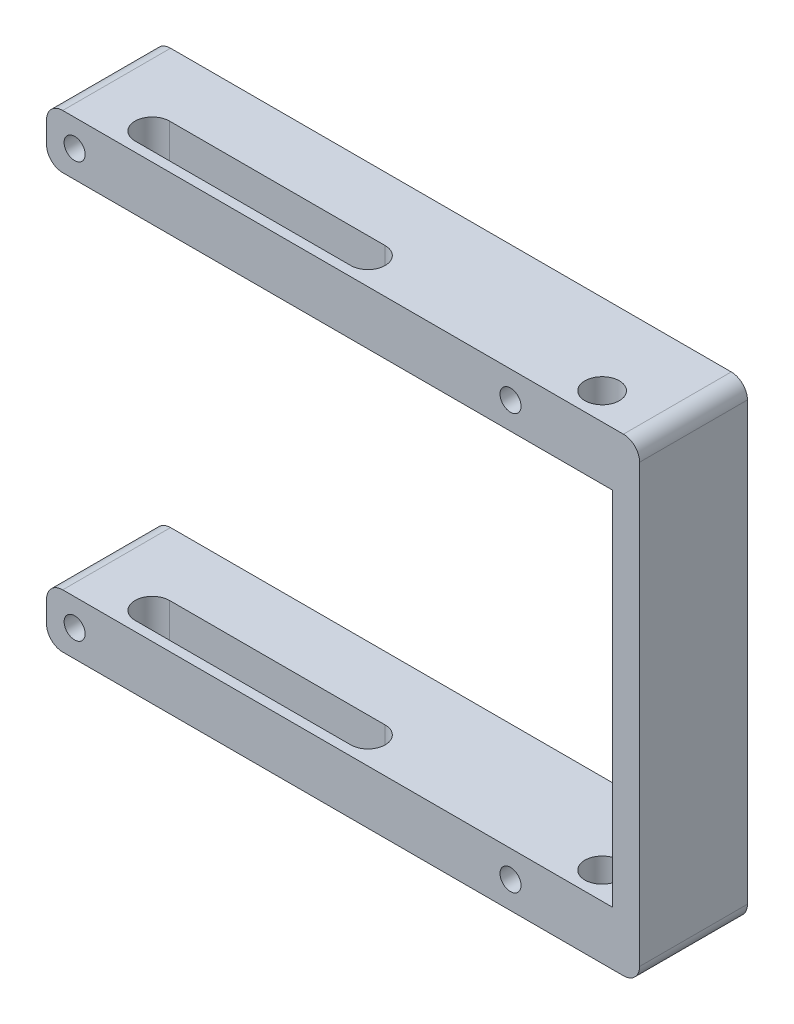
ISO-10303-21;
HEADER;
FILE_DESCRIPTION(('STEP AP214'),'2;1');
FILE_NAME('part.step','',(''),(''),'','','');
FILE_SCHEMA(('AUTOMOTIVE_DESIGN { 1 0 10303 214 1 1 1 1 }'));
ENDSEC;
DATA;
#1=APPLICATION_CONTEXT('core data for automotive mechanical design processes');
#2=APPLICATION_PROTOCOL_DEFINITION('international standard','automotive_design',2000,#1);
#3=PRODUCT_CONTEXT('',#1,'mechanical');
#4=PRODUCT('Part','Part','',(#3));
#5=PRODUCT_RELATED_PRODUCT_CATEGORY('part','',(#4));
#6=PRODUCT_DEFINITION_FORMATION('','',#4);
#7=PRODUCT_DEFINITION_CONTEXT('part definition',#1,'design');
#8=PRODUCT_DEFINITION('design','',#6,#7);
#9=PRODUCT_DEFINITION_SHAPE('','',#8);
#10=(LENGTH_UNIT() NAMED_UNIT(*) SI_UNIT(.MILLI.,.METRE.));
#11=(NAMED_UNIT(*) PLANE_ANGLE_UNIT() SI_UNIT($,.RADIAN.));
#12=(NAMED_UNIT(*) SI_UNIT($,.STERADIAN.) SOLID_ANGLE_UNIT());
#13=UNCERTAINTY_MEASURE_WITH_UNIT(LENGTH_MEASURE(1.E-05),#10,'distance_accuracy_value','');
#14=(GEOMETRIC_REPRESENTATION_CONTEXT(3) GLOBAL_UNCERTAINTY_ASSIGNED_CONTEXT((#13)) GLOBAL_UNIT_ASSIGNED_CONTEXT((#10,
#11,#12)) REPRESENTATION_CONTEXT('',''));
#15=CARTESIAN_POINT('',(0.,0.,0.));
#16=DIRECTION('',(0.,0.,1.));
#17=DIRECTION('',(1.,0.,0.));
#18=AXIS2_PLACEMENT_3D('',#15,#16,#17);
#19=CARTESIAN_POINT('',(0.,82.,10.));
#20=DIRECTION('',(0.,-1.,0.));
#21=DIRECTION('',(1.,0.,0.));
#22=AXIS2_PLACEMENT_3D('',#19,#20,#21);
#23=PLANE('',#22);
#24=CARTESIAN_POINT('',(55.8604947928131,82.,5.));
#25=DIRECTION('',(0.,-1.,0.));
#26=DIRECTION('',(1.,0.,0.));
#27=AXIS2_PLACEMENT_3D('',#24,#25,#26);
#28=CIRCLE('',#27,3.2);
#29=CARTESIAN_POINT('',(59.0604947928131,82.,5.));
#30=VERTEX_POINT('',#29);
#31=EDGE_CURVE('E353',#30,#30,#28,.T.);
#32=ORIENTED_EDGE('',*,*,#31,.F.);
#33=EDGE_LOOP('',(#32));
#34=FACE_BOUND('',#33,.T.);
#35=CARTESIAN_POINT('',(12.4256524417899,82.,5.00000000000001));
#36=DIRECTION('',(0.,-1.,0.));
#37=DIRECTION('',(1.,0.,0.));
#38=AXIS2_PLACEMENT_3D('',#35,#36,#37);
#39=CIRCLE('',#38,3.2);
#40=CARTESIAN_POINT('',(12.4256524417899,82.,1.80000000000001));
#41=VERTEX_POINT('',#40);
#42=CARTESIAN_POINT('',(12.4256524417899,82.,8.20000000000001));
#43=VERTEX_POINT('',#42);
#44=EDGE_CURVE('E348',#41,#43,#39,.T.);
#45=ORIENTED_EDGE('',*,*,#44,.F.);
#46=DIRECTION('',(1.,0.,0.));
#47=VECTOR('',#46,1.);
#48=CARTESIAN_POINT('',(0.,82.,1.80000000000001));
#49=LINE('',#48,#47);
#50=CARTESIAN_POINT('',(-27.5743475582102,82.0000000000001,1.80000000000001));
#51=VERTEX_POINT('',#50);
#52=EDGE_CURVE('E332',#51,#41,#49,.T.);
#53=ORIENTED_EDGE('',*,*,#52,.F.);
#54=CARTESIAN_POINT('',(-27.5743475582101,82.0000000000001,5.));
#55=DIRECTION('',(0.,-1.,0.));
#56=DIRECTION('',(1.,0.,0.));
#57=AXIS2_PLACEMENT_3D('',#54,#55,#56);
#58=CIRCLE('',#57,3.2);
#59=CARTESIAN_POINT('',(-27.5743475582101,82.0000000000001,8.20000000000002));
#60=VERTEX_POINT('',#59);
#61=EDGE_CURVE('E337',#60,#51,#58,.T.);
#62=ORIENTED_EDGE('',*,*,#61,.F.);
#63=DIRECTION('',(-1.,0.,0.));
#64=VECTOR('',#63,1.);
#65=CARTESIAN_POINT('',(0.,82.,8.20000000000001));
#66=LINE('',#65,#64);
#67=EDGE_CURVE('E343',#43,#60,#66,.T.);
#68=ORIENTED_EDGE('',*,*,#67,.F.);
#69=EDGE_LOOP('',(#45,#53,#62,#68));
#70=FACE_BOUND('',#69,.T.);
#71=DIRECTION('',(-1.,0.,0.));
#72=VECTOR('',#71,1.);
#73=CARTESIAN_POINT('',(0.,82.,10.));
#74=LINE('',#73,#72);
#75=CARTESIAN_POINT('',(62.8142757664546,82.,10.));
#76=VERTEX_POINT('',#75);
#77=CARTESIAN_POINT('',(-39.1857242335454,82.0000000000001,10.));
#78=VERTEX_POINT('',#77);
#79=EDGE_CURVE('E356',#76,#78,#74,.T.);
#80=ORIENTED_EDGE('',*,*,#79,.T.);
#81=DIRECTION('',(0.,0.,-1.));
#82=VECTOR('',#81,1.);
#83=CARTESIAN_POINT('',(-39.1857242335454,82.0000000000001,0.));
#84=LINE('',#83,#82);
#85=CARTESIAN_POINT('',(-39.1857242335454,82.0000000000001,-10.));
#86=VERTEX_POINT('',#85);
#87=EDGE_CURVE('E11',#78,#86,#84,.T.);
#88=ORIENTED_EDGE('',*,*,#87,.T.);
#89=DIRECTION('',(-1.,0.,0.));
#90=VECTOR('',#89,1.);
#91=CARTESIAN_POINT('',(62.8142757664546,82.,-10.));
#92=LINE('',#91,#90);
#93=CARTESIAN_POINT('',(62.8142757664546,82.,-10.));
#94=VERTEX_POINT('',#93);
#95=EDGE_CURVE('E243',#94,#86,#92,.T.);
#96=ORIENTED_EDGE('',*,*,#95,.F.);
#97=DIRECTION('',(0.,0.,-1.));
#98=VECTOR('',#97,1.);
#99=CARTESIAN_POINT('',(62.8142757664546,82.,10.));
#100=LINE('',#99,#98);
#101=EDGE_CURVE('E195',#76,#94,#100,.T.);
#102=ORIENTED_EDGE('',*,*,#101,.F.);
#103=EDGE_LOOP('',(#80,#88,#96,#102));
#104=FACE_BOUND('',#103,.T.);
#105=ADVANCED_FACE('F38',(#34,#70,#104),#23,.T.);
#106=CARTESIAN_POINT('',(62.8142757664546,0.,10.));
#107=DIRECTION('',(1.,0.,0.));
#108=DIRECTION('',(0.,1.,0.));
#109=AXIS2_PLACEMENT_3D('',#106,#107,#108);
#110=PLANE('',#109);
#111=ORIENTED_EDGE('',*,*,#101,.T.);
#112=DIRECTION('',(0.,1.,0.));
#113=VECTOR('',#112,1.);
#114=CARTESIAN_POINT('',(62.8142757664546,15.,-10.));
#115=LINE('',#114,#113);
#116=CARTESIAN_POINT('',(62.8142757664546,15.,-10.));
#117=VERTEX_POINT('',#116);
#118=EDGE_CURVE('E240',#117,#94,#115,.T.);
#119=ORIENTED_EDGE('',*,*,#118,.F.);
#120=DIRECTION('',(0.,0.,-1.));
#121=VECTOR('',#120,1.);
#122=CARTESIAN_POINT('',(62.8142757664546,15.,10.));
#123=LINE('',#122,#121);
#124=CARTESIAN_POINT('',(62.8142757664546,15.,10.));
#125=VERTEX_POINT('',#124);
#126=EDGE_CURVE('E377',#125,#117,#123,.T.);
#127=ORIENTED_EDGE('',*,*,#126,.F.);
#128=DIRECTION('',(0.,-1.,0.));
#129=VECTOR('',#128,1.);
#130=CARTESIAN_POINT('',(62.8142757664546,0.,10.));
#131=LINE('',#130,#129);
#132=EDGE_CURVE('E359',#76,#125,#131,.T.);
#133=ORIENTED_EDGE('',*,*,#132,.F.);
#134=EDGE_LOOP('',(#111,#119,#127,#133));
#135=FACE_BOUND('',#134,.T.);
#136=ADVANCED_FACE('F420',(#135),#110,.F.);
#137=CARTESIAN_POINT('',(0.,15.,10.));
#138=DIRECTION('',(0.,-1.,0.));
#139=DIRECTION('',(1.,0.,0.));
#140=AXIS2_PLACEMENT_3D('',#137,#138,#139);
#141=PLANE('',#140);
#142=CARTESIAN_POINT('',(55.860494792813,15.,5.));
#143=DIRECTION('',(0.,-1.,0.));
#144=DIRECTION('',(1.,0.,0.));
#145=AXIS2_PLACEMENT_3D('',#142,#143,#144);
#146=CIRCLE('',#145,3.2);
#147=CARTESIAN_POINT('',(59.060494792813,15.,5.));
#148=VERTEX_POINT('',#147);
#149=EDGE_CURVE('E350',#148,#148,#146,.T.);
#150=ORIENTED_EDGE('',*,*,#149,.T.);
#151=EDGE_LOOP('',(#150));
#152=FACE_BOUND('',#151,.T.);
#153=DIRECTION('',(1.,0.,0.));
#154=VECTOR('',#153,1.);
#155=CARTESIAN_POINT('',(0.,15.,1.80000000000001));
#156=LINE('',#155,#154);
#157=CARTESIAN_POINT('',(-27.5743475582102,15.,1.8));
#158=VERTEX_POINT('',#157);
#159=CARTESIAN_POINT('',(12.4256524417899,15.,1.80000000000001));
#160=VERTEX_POINT('',#159);
#161=EDGE_CURVE('E289',#158,#160,#156,.T.);
#162=ORIENTED_EDGE('',*,*,#161,.T.);
#163=CARTESIAN_POINT('',(12.4256524417898,15.,5.00000000000001));
#164=DIRECTION('',(0.,-1.,0.));
#165=DIRECTION('',(1.,0.,0.));
#166=AXIS2_PLACEMENT_3D('',#163,#164,#165);
#167=CIRCLE('',#166,3.2);
#168=CARTESIAN_POINT('',(12.4256524417898,15.,8.20000000000001));
#169=VERTEX_POINT('',#168);
#170=EDGE_CURVE('E345',#160,#169,#167,.T.);
#171=ORIENTED_EDGE('',*,*,#170,.T.);
#172=DIRECTION('',(-1.,0.,0.));
#173=VECTOR('',#172,1.);
#174=CARTESIAN_POINT('',(0.,15.,8.20000000000001));
#175=LINE('',#174,#173);
#176=CARTESIAN_POINT('',(-27.5743475582102,15.,8.20000000000002));
#177=VERTEX_POINT('',#176);
#178=EDGE_CURVE('E340',#169,#177,#175,.T.);
#179=ORIENTED_EDGE('',*,*,#178,.T.);
#180=CARTESIAN_POINT('',(-27.5743475582102,15.,5.));
#181=DIRECTION('',(0.,-1.,0.));
#182=DIRECTION('',(1.,0.,0.));
#183=AXIS2_PLACEMENT_3D('',#180,#181,#182);
#184=CIRCLE('',#183,3.2);
#185=EDGE_CURVE('E334',#177,#158,#184,.T.);
#186=ORIENTED_EDGE('',*,*,#185,.T.);
#187=EDGE_LOOP('',(#162,#171,#179,#186));
#188=FACE_BOUND('',#187,.T.);
#189=ORIENTED_EDGE('',*,*,#126,.T.);
#190=DIRECTION('',(1.,0.,0.));
#191=VECTOR('',#190,1.);
#192=CARTESIAN_POINT('',(-39.1857242335454,15.,-10.));
#193=LINE('',#192,#191);
#194=CARTESIAN_POINT('',(-39.1857242335454,15.,-10.));
#195=VERTEX_POINT('',#194);
#196=EDGE_CURVE('E237',#195,#117,#193,.T.);
#197=ORIENTED_EDGE('',*,*,#196,.F.);
#198=DIRECTION('',(0.,0.,-1.));
#199=VECTOR('',#198,1.);
#200=CARTESIAN_POINT('',(-39.1857242335454,15.,10.));
#201=LINE('',#200,#199);
#202=CARTESIAN_POINT('',(-39.1857242335454,15.,10.));
#203=VERTEX_POINT('',#202);
#204=EDGE_CURVE('E404',#195,#203,#201,.F.);
#205=ORIENTED_EDGE('',*,*,#204,.T.);
#206=DIRECTION('',(-1.,0.,0.));
#207=VECTOR('',#206,1.);
#208=CARTESIAN_POINT('',(0.,15.,10.));
#209=LINE('',#208,#207);
#210=EDGE_CURVE('E361',#125,#203,#209,.T.);
#211=ORIENTED_EDGE('',*,*,#210,.F.);
#212=EDGE_LOOP('',(#189,#197,#205,#211));
#213=FACE_BOUND('',#212,.T.);
#214=ADVANCED_FACE('F470',(#152,#188,#213),#141,.F.);
#215=CARTESIAN_POINT('',(-42.1857242335454,0.,10.));
#216=DIRECTION('',(-1.,0.,0.));
#217=DIRECTION('',(0.,0.,1.));
#218=AXIS2_PLACEMENT_3D('',#215,#216,#217);
#219=PLANE('',#218);
#220=DIRECTION('',(0.,0.,-1.));
#221=VECTOR('',#220,1.);
#222=CARTESIAN_POINT('',(-42.1857242335454,12.,0.));
#223=LINE('',#222,#221);
#224=CARTESIAN_POINT('',(-42.1857242335454,12.,10.));
#225=VERTEX_POINT('',#224);
#226=CARTESIAN_POINT('',(-42.1857242335454,12.,-10.));
#227=VERTEX_POINT('',#226);
#228=EDGE_CURVE('E400',#225,#227,#223,.T.);
#229=ORIENTED_EDGE('',*,*,#228,.T.);
#230=DIRECTION('',(0.,1.,0.));
#231=VECTOR('',#230,1.);
#232=CARTESIAN_POINT('',(-42.1857242335454,7.99999999999997,-10.));
#233=LINE('',#232,#231);
#234=CARTESIAN_POINT('',(-42.1857242335454,7.99999999999997,-10.));
#235=VERTEX_POINT('',#234);
#236=EDGE_CURVE('E231',#235,#227,#233,.T.);
#237=ORIENTED_EDGE('',*,*,#236,.F.);
#238=DIRECTION('',(0.,0.,-1.));
#239=VECTOR('',#238,1.);
#240=CARTESIAN_POINT('',(-42.1857242335454,7.99999999999997,10.));
#241=LINE('',#240,#239);
#242=CARTESIAN_POINT('',(-42.1857242335454,7.99999999999997,10.));
#243=VERTEX_POINT('',#242);
#244=EDGE_CURVE('E402',#235,#243,#241,.F.);
#245=ORIENTED_EDGE('',*,*,#244,.T.);
#246=DIRECTION('',(0.,1.,0.));
#247=VECTOR('',#246,1.);
#248=CARTESIAN_POINT('',(-42.1857242335454,0.,10.));
#249=LINE('',#248,#247);
#250=EDGE_CURVE('E364',#243,#225,#249,.T.);
#251=ORIENTED_EDGE('',*,*,#250,.T.);
#252=EDGE_LOOP('',(#229,#237,#245,#251));
#253=FACE_BOUND('',#252,.T.);
#254=ADVANCED_FACE('F432',(#253),#219,.T.);
#255=CARTESIAN_POINT('',(0.,4.99999999999998,10.));
#256=DIRECTION('',(0.,-1.,0.));
#257=DIRECTION('',(1.,0.,0.));
#258=AXIS2_PLACEMENT_3D('',#255,#256,#257);
#259=PLANE('',#258);
#260=CARTESIAN_POINT('',(55.860494792813,4.99999999999991,5.));
#261=DIRECTION('',(0.,1.,0.));
#262=DIRECTION('',(-1.,0.,0.));
#263=AXIS2_PLACEMENT_3D('',#260,#261,#262);
#264=CIRCLE('',#263,3.2);
#265=CARTESIAN_POINT('',(52.660494792813,4.99999999999991,5.));
#266=VERTEX_POINT('',#265);
#267=EDGE_CURVE('E286',#266,#266,#264,.T.);
#268=ORIENTED_EDGE('',*,*,#267,.T.);
#269=EDGE_LOOP('',(#268));
#270=FACE_BOUND('',#269,.T.);
#271=CARTESIAN_POINT('',(12.4256524417898,4.99999999999994,5.00000000000001));
#272=DIRECTION('',(0.,1.,0.));
#273=DIRECTION('',(-1.,0.,0.));
#274=AXIS2_PLACEMENT_3D('',#271,#272,#273);
#275=CIRCLE('',#274,3.2);
#276=CARTESIAN_POINT('',(12.4256524417898,4.99999999999994,8.20000000000001));
#277=VERTEX_POINT('',#276);
#278=CARTESIAN_POINT('',(12.4256524417898,4.99999999999994,1.80000000000001));
#279=VERTEX_POINT('',#278);
#280=EDGE_CURVE('E294',#277,#279,#275,.T.);
#281=ORIENTED_EDGE('',*,*,#280,.T.);
#282=DIRECTION('',(-1.,0.,0.));
#283=VECTOR('',#282,1.);
#284=CARTESIAN_POINT('',(12.4256524417898,4.99999999999994,1.80000000000001));
#285=LINE('',#284,#283);
#286=CARTESIAN_POINT('',(-27.5743475582102,4.99999999999998,1.80000000000001));
#287=VERTEX_POINT('',#286);
#288=EDGE_CURVE('E297',#279,#287,#285,.T.);
#289=ORIENTED_EDGE('',*,*,#288,.T.);
#290=CARTESIAN_POINT('',(-27.5743475582102,4.99999999999998,5.));
#291=DIRECTION('',(0.,1.,0.));
#292=DIRECTION('',(-1.,0.,0.));
#293=AXIS2_PLACEMENT_3D('',#290,#291,#292);
#294=CIRCLE('',#293,3.2);
#295=CARTESIAN_POINT('',(-27.5743475582102,4.99999999999998,8.20000000000002));
#296=VERTEX_POINT('',#295);
#297=EDGE_CURVE('E301',#287,#296,#294,.T.);
#298=ORIENTED_EDGE('',*,*,#297,.T.);
#299=DIRECTION('',(1.,0.,0.));
#300=VECTOR('',#299,1.);
#301=CARTESIAN_POINT('',(12.4256524417898,4.99999999999994,8.20000000000001));
#302=LINE('',#301,#300);
#303=EDGE_CURVE('E304',#296,#277,#302,.T.);
#304=ORIENTED_EDGE('',*,*,#303,.T.);
#305=EDGE_LOOP('',(#281,#289,#298,#304));
#306=FACE_BOUND('',#305,.T.);
#307=DIRECTION('',(0.,0.,-1.));
#308=VECTOR('',#307,1.);
#309=CARTESIAN_POINT('',(-39.1857242335454,4.99999999999997,10.));
#310=LINE('',#309,#308);
#311=CARTESIAN_POINT('',(-39.1857242335454,4.99999999999997,10.));
#312=VERTEX_POINT('',#311);
#313=CARTESIAN_POINT('',(-39.1857242335454,4.99999999999997,-10.));
#314=VERTEX_POINT('',#313);
#315=EDGE_CURVE('E396',#312,#314,#310,.T.);
#316=ORIENTED_EDGE('',*,*,#315,.T.);
#317=DIRECTION('',(-1.,0.,0.));
#318=VECTOR('',#317,1.);
#319=CARTESIAN_POINT('',(64.8142757664545,4.99999999999999,-10.));
#320=LINE('',#319,#318);
#321=CARTESIAN_POINT('',(64.8142757664545,4.99999999999999,-10.));
#322=VERTEX_POINT('',#321);
#323=EDGE_CURVE('E225',#322,#314,#320,.T.);
#324=ORIENTED_EDGE('',*,*,#323,.F.);
#325=DIRECTION('',(0.,0.,-1.));
#326=VECTOR('',#325,1.);
#327=CARTESIAN_POINT('',(64.8142757664545,4.99999999999999,10.));
#328=LINE('',#327,#326);
#329=CARTESIAN_POINT('',(64.8142757664545,4.99999999999999,10.));
#330=VERTEX_POINT('',#329);
#331=EDGE_CURVE('E398',#322,#330,#328,.F.);
#332=ORIENTED_EDGE('',*,*,#331,.T.);
#333=DIRECTION('',(-1.,0.,0.));
#334=VECTOR('',#333,1.);
#335=CARTESIAN_POINT('',(0.,4.99999999999998,10.));
#336=LINE('',#335,#334);
#337=EDGE_CURVE('E367',#330,#312,#336,.T.);
#338=ORIENTED_EDGE('',*,*,#337,.T.);
#339=EDGE_LOOP('',(#316,#324,#332,#338));
#340=FACE_BOUND('',#339,.T.);
#341=ADVANCED_FACE('F442',(#270,#306,#340),#259,.T.);
#342=CARTESIAN_POINT('',(67.8142757664545,0.,10.));
#343=DIRECTION('',(1.,0.,0.));
#344=DIRECTION('',(0.,1.,0.));
#345=AXIS2_PLACEMENT_3D('',#342,#343,#344);
#346=PLANE('',#345);
#347=DIRECTION('',(0.,0.,-1.));
#348=VECTOR('',#347,1.);
#349=CARTESIAN_POINT('',(67.8142757664545,7.99999999999998,10.));
#350=LINE('',#349,#348);
#351=CARTESIAN_POINT('',(67.8142757664545,7.99999999999998,10.));
#352=VERTEX_POINT('',#351);
#353=CARTESIAN_POINT('',(67.8142757664545,7.99999999999998,-10.));
#354=VERTEX_POINT('',#353);
#355=EDGE_CURVE('E381',#352,#354,#350,.T.);
#356=ORIENTED_EDGE('',*,*,#355,.T.);
#357=DIRECTION('',(0.,-1.,0.));
#358=VECTOR('',#357,1.);
#359=CARTESIAN_POINT('',(67.8142757664546,89.,-10.));
#360=LINE('',#359,#358);
#361=CARTESIAN_POINT('',(67.8142757664546,89.,-10.));
#362=VERTEX_POINT('',#361);
#363=EDGE_CURVE('E219',#362,#354,#360,.T.);
#364=ORIENTED_EDGE('',*,*,#363,.F.);
#365=DIRECTION('',(0.,0.,-1.));
#366=VECTOR('',#365,1.);
#367=CARTESIAN_POINT('',(67.8142757664546,89.,10.));
#368=LINE('',#367,#366);
#369=CARTESIAN_POINT('',(67.8142757664546,89.,10.));
#370=VERTEX_POINT('',#369);
#371=EDGE_CURVE('E383',#362,#370,#368,.F.);
#372=ORIENTED_EDGE('',*,*,#371,.T.);
#373=DIRECTION('',(0.,-1.,0.));
#374=VECTOR('',#373,1.);
#375=CARTESIAN_POINT('',(67.8142757664545,0.,10.));
#376=LINE('',#375,#374);
#377=EDGE_CURVE('E370',#370,#352,#376,.T.);
#378=ORIENTED_EDGE('',*,*,#377,.T.);
#379=EDGE_LOOP('',(#356,#364,#372,#378));
#380=FACE_BOUND('',#379,.T.);
#381=ADVANCED_FACE('F449',(#380),#346,.T.);
#382=CARTESIAN_POINT('',(0.,92.,10.));
#383=DIRECTION('',(0.,-1.,0.));
#384=DIRECTION('',(1.,0.,0.));
#385=AXIS2_PLACEMENT_3D('',#382,#383,#384);
#386=PLANE('',#385);
#387=CARTESIAN_POINT('',(55.8604947928131,92.,5.));
#388=DIRECTION('',(0.,1.,0.));
#389=DIRECTION('',(-1.,0.,0.));
#390=AXIS2_PLACEMENT_3D('',#387,#388,#389);
#391=CIRCLE('',#390,3.2);
#392=CARTESIAN_POINT('',(52.6604947928131,92.,5.));
#393=VERTEX_POINT('',#392);
#394=EDGE_CURVE('E290',#393,#393,#391,.T.);
#395=ORIENTED_EDGE('',*,*,#394,.F.);
#396=EDGE_LOOP('',(#395));
#397=FACE_BOUND('',#396,.T.);
#398=DIRECTION('',(-1.,0.,0.));
#399=VECTOR('',#398,1.);
#400=CARTESIAN_POINT('',(12.4256524417899,92.,1.80000000000001));
#401=LINE('',#400,#399);
#402=CARTESIAN_POINT('',(12.4256524417899,92.,1.80000000000001));
#403=VERTEX_POINT('',#402);
#404=CARTESIAN_POINT('',(-27.5743475582101,92.0000000000001,1.8));
#405=VERTEX_POINT('',#404);
#406=EDGE_CURVE('E309',#403,#405,#401,.T.);
#407=ORIENTED_EDGE('',*,*,#406,.F.);
#408=CARTESIAN_POINT('',(12.4256524417899,92.,5.00000000000001));
#409=DIRECTION('',(0.,1.,0.));
#410=DIRECTION('',(-1.,0.,0.));
#411=AXIS2_PLACEMENT_3D('',#408,#409,#410);
#412=CIRCLE('',#411,3.2);
#413=CARTESIAN_POINT('',(12.4256524417899,92.,8.20000000000001));
#414=VERTEX_POINT('',#413);
#415=EDGE_CURVE('E283',#414,#403,#412,.T.);
#416=ORIENTED_EDGE('',*,*,#415,.F.);
#417=DIRECTION('',(1.,0.,0.));
#418=VECTOR('',#417,1.);
#419=CARTESIAN_POINT('',(12.4256524417899,92.,8.20000000000001));
#420=LINE('',#419,#418);
#421=CARTESIAN_POINT('',(-27.5743475582101,92.0000000000001,8.20000000000002));
#422=VERTEX_POINT('',#421);
#423=EDGE_CURVE('E298',#422,#414,#420,.T.);
#424=ORIENTED_EDGE('',*,*,#423,.F.);
#425=CARTESIAN_POINT('',(-27.5743475582101,92.0000000000001,5.));
#426=DIRECTION('',(0.,1.,0.));
#427=DIRECTION('',(-1.,0.,0.));
#428=AXIS2_PLACEMENT_3D('',#425,#426,#427);
#429=CIRCLE('',#428,3.2);
#430=EDGE_CURVE('E312',#405,#422,#429,.T.);
#431=ORIENTED_EDGE('',*,*,#430,.F.);
#432=EDGE_LOOP('',(#407,#416,#424,#431));
#433=FACE_BOUND('',#432,.T.);
#434=DIRECTION('',(-1.,0.,0.));
#435=VECTOR('',#434,1.);
#436=CARTESIAN_POINT('',(0.,92.,10.));
#437=LINE('',#436,#435);
#438=CARTESIAN_POINT('',(64.8142757664546,92.,10.));
#439=VERTEX_POINT('',#438);
#440=CARTESIAN_POINT('',(-39.1857242335454,92.0000000000001,10.));
#441=VERTEX_POINT('',#440);
#442=EDGE_CURVE('E373',#439,#441,#437,.T.);
#443=ORIENTED_EDGE('',*,*,#442,.F.);
#444=DIRECTION('',(0.,0.,-1.));
#445=VECTOR('',#444,1.);
#446=CARTESIAN_POINT('',(64.8142757664546,92.,0.));
#447=LINE('',#446,#445);
#448=CARTESIAN_POINT('',(64.8142757664546,92.,-10.));
#449=VERTEX_POINT('',#448);
#450=EDGE_CURVE('E194',#439,#449,#447,.T.);
#451=ORIENTED_EDGE('',*,*,#450,.T.);
#452=DIRECTION('',(1.,0.,0.));
#453=VECTOR('',#452,1.);
#454=CARTESIAN_POINT('',(-39.1857242335454,92.0000000000001,-10.));
#455=LINE('',#454,#453);
#456=CARTESIAN_POINT('',(-39.1857242335454,92.0000000000001,-10.));
#457=VERTEX_POINT('',#456);
#458=EDGE_CURVE('E198',#457,#449,#455,.T.);
#459=ORIENTED_EDGE('',*,*,#458,.F.);
#460=DIRECTION('',(0.,0.,-1.));
#461=VECTOR('',#460,1.);
#462=CARTESIAN_POINT('',(-39.1857242335454,92.0000000000001,10.));
#463=LINE('',#462,#461);
#464=EDGE_CURVE('E186',#457,#441,#463,.F.);
#465=ORIENTED_EDGE('',*,*,#464,.T.);
#466=EDGE_LOOP('',(#443,#451,#459,#465));
#467=FACE_BOUND('',#466,.T.);
#468=ADVANCED_FACE('F199',(#397,#433,#467),#386,.F.);
#469=CARTESIAN_POINT('',(-42.1857242335454,0.,10.));
#470=DIRECTION('',(1.,0.,0.));
#471=DIRECTION('',(0.,0.,-1.));
#472=AXIS2_PLACEMENT_3D('',#469,#470,#471);
#473=PLANE('',#472);
#474=DIRECTION('',(0.,-1.,0.));
#475=VECTOR('',#474,1.);
#476=CARTESIAN_POINT('',(-42.1857242335454,0.,10.));
#477=LINE('',#476,#475);
#478=CARTESIAN_POINT('',(-42.1857242335454,89.0000000000001,10.));
#479=VERTEX_POINT('',#478);
#480=CARTESIAN_POINT('',(-42.1857242335454,85.0000000000001,10.));
#481=VERTEX_POINT('',#480);
#482=EDGE_CURVE('E375',#479,#481,#477,.T.);
#483=ORIENTED_EDGE('',*,*,#482,.F.);
#484=DIRECTION('',(0.,0.,-1.));
#485=VECTOR('',#484,1.);
#486=CARTESIAN_POINT('',(-42.1857242335454,89.0000000000001,10.));
#487=LINE('',#486,#485);
#488=CARTESIAN_POINT('',(-42.1857242335454,89.0000000000001,-10.));
#489=VERTEX_POINT('',#488);
#490=EDGE_CURVE('E46',#479,#489,#487,.T.);
#491=ORIENTED_EDGE('',*,*,#490,.T.);
#492=DIRECTION('',(0.,1.,0.));
#493=VECTOR('',#492,1.);
#494=CARTESIAN_POINT('',(-42.1857242335454,85.0000000000001,-10.));
#495=LINE('',#494,#493);
#496=CARTESIAN_POINT('',(-42.1857242335454,85.0000000000001,-10.));
#497=VERTEX_POINT('',#496);
#498=EDGE_CURVE('E210',#497,#489,#495,.T.);
#499=ORIENTED_EDGE('',*,*,#498,.F.);
#500=DIRECTION('',(0.,0.,-1.));
#501=VECTOR('',#500,1.);
#502=CARTESIAN_POINT('',(-42.1857242335454,85.0000000000001,10.));
#503=LINE('',#502,#501);
#504=EDGE_CURVE('E53',#497,#481,#503,.F.);
#505=ORIENTED_EDGE('',*,*,#504,.T.);
#506=EDGE_LOOP('',(#483,#491,#499,#505));
#507=FACE_BOUND('',#506,.T.);
#508=ADVANCED_FACE('F406',(#507),#473,.F.);
#509=CARTESIAN_POINT('',(0.,0.,10.));
#510=DIRECTION('',(0.,0.,1.));
#511=DIRECTION('',(1.,0.,0.));
#512=AXIS2_PLACEMENT_3D('',#509,#510,#511);
#513=PLANE('',#512);
#514=CARTESIAN_POINT('',(43.8693009617179,87.0000000000001,10.));
#515=DIRECTION('',(0.,0.,1.));
#516=DIRECTION('',(1.,0.,0.));
#517=AXIS2_PLACEMENT_3D('',#514,#515,#516);
#518=CIRCLE('',#517,1.95);
#519=CARTESIAN_POINT('',(45.8193009617179,87.0000000000001,10.));
#520=VERTEX_POINT('',#519);
#521=EDGE_CURVE('E261',#520,#520,#518,.T.);
#522=ORIENTED_EDGE('',*,*,#521,.F.);
#523=EDGE_LOOP('',(#522));
#524=FACE_BOUND('',#523,.T.);
#525=CARTESIAN_POINT('',(43.8693009617179,9.99999999999997,10.));
#526=DIRECTION('',(0.,0.,1.));
#527=DIRECTION('',(1.,0.,0.));
#528=AXIS2_PLACEMENT_3D('',#525,#526,#527);
#529=CIRCLE('',#528,1.95);
#530=CARTESIAN_POINT('',(45.8193009617179,9.99999999999997,10.));
#531=VERTEX_POINT('',#530);
#532=EDGE_CURVE('E272',#531,#531,#529,.T.);
#533=ORIENTED_EDGE('',*,*,#532,.F.);
#534=EDGE_LOOP('',(#533));
#535=FACE_BOUND('',#534,.T.);
#536=CARTESIAN_POINT('',(-36.9798348407513,9.99999999999997,10.));
#537=DIRECTION('',(0.,0.,1.));
#538=DIRECTION('',(1.,0.,0.));
#539=AXIS2_PLACEMENT_3D('',#536,#537,#538);
#540=CIRCLE('',#539,1.95);
#541=CARTESIAN_POINT('',(-35.0298348407513,9.99999999999997,10.));
#542=VERTEX_POINT('',#541);
#543=EDGE_CURVE('E266',#542,#542,#540,.T.);
#544=ORIENTED_EDGE('',*,*,#543,.F.);
#545=EDGE_LOOP('',(#544));
#546=FACE_BOUND('',#545,.T.);
#547=CARTESIAN_POINT('',(-36.9798348407513,87.0000000000001,10.));
#548=DIRECTION('',(0.,0.,1.));
#549=DIRECTION('',(1.,0.,0.));
#550=AXIS2_PLACEMENT_3D('',#547,#548,#549);
#551=CIRCLE('',#550,1.95);
#552=CARTESIAN_POINT('',(-35.0298348407514,87.0000000000001,10.));
#553=VERTEX_POINT('',#552);
#554=EDGE_CURVE('E265',#553,#553,#551,.T.);
#555=ORIENTED_EDGE('',*,*,#554,.F.);
#556=EDGE_LOOP('',(#555));
#557=FACE_BOUND('',#556,.T.);
#558=ORIENTED_EDGE('',*,*,#377,.F.);
#559=CARTESIAN_POINT('',(64.8142757664546,89.,10.));
#560=DIRECTION('',(0.,0.,1.));
#561=DIRECTION('',(1.,0.,0.));
#562=AXIS2_PLACEMENT_3D('',#559,#560,#561);
#563=CIRCLE('',#562,3.);
#564=EDGE_CURVE('E394',#370,#439,#563,.T.);
#565=ORIENTED_EDGE('',*,*,#564,.T.);
#566=ORIENTED_EDGE('',*,*,#442,.T.);
#567=CARTESIAN_POINT('',(-39.1857242335454,89.0000000000001,10.));
#568=DIRECTION('',(0.,0.,1.));
#569=DIRECTION('',(1.,0.,0.));
#570=AXIS2_PLACEMENT_3D('',#567,#568,#569);
#571=CIRCLE('',#570,3.);
#572=EDGE_CURVE('E60',#441,#479,#571,.T.);
#573=ORIENTED_EDGE('',*,*,#572,.T.);
#574=ORIENTED_EDGE('',*,*,#482,.T.);
#575=CARTESIAN_POINT('',(-39.1857242335454,85.0000000000001,10.));
#576=DIRECTION('',(0.,0.,1.));
#577=DIRECTION('',(1.,0.,0.));
#578=AXIS2_PLACEMENT_3D('',#575,#576,#577);
#579=CIRCLE('',#578,3.);
#580=EDGE_CURVE('E385',#481,#78,#579,.T.);
#581=ORIENTED_EDGE('',*,*,#580,.T.);
#582=ORIENTED_EDGE('',*,*,#79,.F.);
#583=ORIENTED_EDGE('',*,*,#132,.T.);
#584=ORIENTED_EDGE('',*,*,#210,.T.);
#585=CARTESIAN_POINT('',(-39.1857242335454,12.,10.));
#586=DIRECTION('',(0.,0.,1.));
#587=DIRECTION('',(1.,0.,0.));
#588=AXIS2_PLACEMENT_3D('',#585,#586,#587);
#589=CIRCLE('',#588,3.);
#590=EDGE_CURVE('E388',#203,#225,#589,.T.);
#591=ORIENTED_EDGE('',*,*,#590,.T.);
#592=ORIENTED_EDGE('',*,*,#250,.F.);
#593=CARTESIAN_POINT('',(-39.1857242335454,7.99999999999997,10.));
#594=DIRECTION('',(0.,0.,1.));
#595=DIRECTION('',(1.,0.,0.));
#596=AXIS2_PLACEMENT_3D('',#593,#594,#595);
#597=CIRCLE('',#596,3.);
#598=EDGE_CURVE('E390',#243,#312,#597,.T.);
#599=ORIENTED_EDGE('',*,*,#598,.T.);
#600=ORIENTED_EDGE('',*,*,#337,.F.);
#601=CARTESIAN_POINT('',(64.8142757664545,7.99999999999999,10.));
#602=DIRECTION('',(0.,0.,1.));
#603=DIRECTION('',(1.,0.,0.));
#604=AXIS2_PLACEMENT_3D('',#601,#602,#603);
#605=CIRCLE('',#604,3.);
#606=EDGE_CURVE('E392',#330,#352,#605,.T.);
#607=ORIENTED_EDGE('',*,*,#606,.T.);
#608=EDGE_LOOP('',(#558,#565,#566,#573,#574,#581,#582,#583,#584,#591,#592,#599,#600,#607));
#609=FACE_BOUND('',#608,.T.);
#610=ADVANCED_FACE('F409',(#524,#535,#546,#557,#609),#513,.T.);
#611=CARTESIAN_POINT('',(12.4256524417898,4.99999999999994,1.80000000000001));
#612=DIRECTION('',(0.,0.,-1.));
#613=DIRECTION('',(-1.,0.,0.));
#614=AXIS2_PLACEMENT_3D('',#611,#612,#613);
#615=PLANE('',#614);
#616=ORIENTED_EDGE('',*,*,#52,.T.);
#617=DIRECTION('',(0.,1.,0.));
#618=VECTOR('',#617,1.);
#619=CARTESIAN_POINT('',(12.4256524417898,4.99999999999994,1.80000000000001));
#620=LINE('',#619,#618);
#621=EDGE_CURVE('E307',#41,#403,#620,.T.);
#622=ORIENTED_EDGE('',*,*,#621,.T.);
#623=ORIENTED_EDGE('',*,*,#406,.T.);
#624=DIRECTION('',(0.,1.,0.));
#625=VECTOR('',#624,1.);
#626=CARTESIAN_POINT('',(-27.5743475582102,4.99999999999998,1.8));
#627=LINE('',#626,#625);
#628=EDGE_CURVE('E327',#51,#405,#627,.T.);
#629=ORIENTED_EDGE('',*,*,#628,.F.);
#630=EDGE_LOOP('',(#616,#622,#623,#629));
#631=FACE_BOUND('',#630,.T.);
#632=ADVANCED_FACE('F492',(#631),#615,.F.);
#633=CARTESIAN_POINT('',(-27.5743475582102,4.99999999999998,5.));
#634=DIRECTION('',(0.,1.,0.));
#635=DIRECTION('',(-1.,0.,0.));
#636=AXIS2_PLACEMENT_3D('',#633,#634,#635);
#637=CYLINDRICAL_SURFACE('',#636,3.2);
#638=ORIENTED_EDGE('',*,*,#61,.T.);
#639=ORIENTED_EDGE('',*,*,#628,.T.);
#640=ORIENTED_EDGE('',*,*,#430,.T.);
#641=DIRECTION('',(0.,1.,0.));
#642=VECTOR('',#641,1.);
#643=CARTESIAN_POINT('',(-27.5743475582102,4.99999999999998,8.20000000000002));
#644=LINE('',#643,#642);
#645=EDGE_CURVE('E323',#60,#422,#644,.T.);
#646=ORIENTED_EDGE('',*,*,#645,.F.);
#647=EDGE_LOOP('',(#638,#639,#640,#646));
#648=FACE_BOUND('',#647,.T.);
#649=ADVANCED_FACE('F503',(#648),#637,.F.);
#650=CARTESIAN_POINT('',(12.4256524417898,4.99999999999994,8.20000000000001));
#651=DIRECTION('',(0.,0.,1.));
#652=DIRECTION('',(1.,0.,0.));
#653=AXIS2_PLACEMENT_3D('',#650,#651,#652);
#654=PLANE('',#653);
#655=ORIENTED_EDGE('',*,*,#67,.T.);
#656=ORIENTED_EDGE('',*,*,#645,.T.);
#657=ORIENTED_EDGE('',*,*,#423,.T.);
#658=DIRECTION('',(0.,1.,0.));
#659=VECTOR('',#658,1.);
#660=CARTESIAN_POINT('',(12.4256524417898,4.99999999999994,8.20000000000001));
#661=LINE('',#660,#659);
#662=EDGE_CURVE('E319',#43,#414,#661,.T.);
#663=ORIENTED_EDGE('',*,*,#662,.F.);
#664=EDGE_LOOP('',(#655,#656,#657,#663));
#665=FACE_BOUND('',#664,.T.);
#666=ADVANCED_FACE('F498',(#665),#654,.F.);
#667=CARTESIAN_POINT('',(12.4256524417898,4.99999999999994,5.00000000000001));
#668=DIRECTION('',(0.,1.,0.));
#669=DIRECTION('',(-1.,0.,0.));
#670=AXIS2_PLACEMENT_3D('',#667,#668,#669);
#671=CYLINDRICAL_SURFACE('',#670,3.2);
#672=ORIENTED_EDGE('',*,*,#44,.T.);
#673=ORIENTED_EDGE('',*,*,#662,.T.);
#674=ORIENTED_EDGE('',*,*,#415,.T.);
#675=ORIENTED_EDGE('',*,*,#621,.F.);
#676=EDGE_LOOP('',(#672,#673,#674,#675));
#677=FACE_BOUND('',#676,.T.);
#678=ADVANCED_FACE('F494',(#677),#671,.F.);
#679=CARTESIAN_POINT('',(55.860494792813,4.99999999999991,5.));
#680=DIRECTION('',(0.,1.,0.));
#681=DIRECTION('',(-1.,0.,0.));
#682=AXIS2_PLACEMENT_3D('',#679,#680,#681);
#683=CYLINDRICAL_SURFACE('',#682,3.2);
#684=ORIENTED_EDGE('',*,*,#31,.T.);
#685=EDGE_LOOP('',(#684));
#686=FACE_BOUND('',#685,.T.);
#687=ORIENTED_EDGE('',*,*,#394,.T.);
#688=EDGE_LOOP('',(#687));
#689=FACE_BOUND('',#688,.T.);
#690=ADVANCED_FACE('F497',(#686,#689),#683,.F.);
#691=EDGE_CURVE('E328',#279,#160,#620,.T.);
#692=ORIENTED_EDGE('',*,*,#691,.F.);
#693=ORIENTED_EDGE('',*,*,#280,.F.);
#694=EDGE_CURVE('E293',#277,#169,#661,.T.);
#695=ORIENTED_EDGE('',*,*,#694,.T.);
#696=ORIENTED_EDGE('',*,*,#170,.F.);
#697=EDGE_LOOP('',(#692,#693,#695,#696));
#698=FACE_BOUND('',#697,.T.);
#699=ADVANCED_FACE('F500',(#698),#671,.F.);
#700=ORIENTED_EDGE('',*,*,#694,.F.);
#701=ORIENTED_EDGE('',*,*,#303,.F.);
#702=EDGE_CURVE('E320',#296,#177,#644,.T.);
#703=ORIENTED_EDGE('',*,*,#702,.T.);
#704=ORIENTED_EDGE('',*,*,#178,.F.);
#705=EDGE_LOOP('',(#700,#701,#703,#704));
#706=FACE_BOUND('',#705,.T.);
#707=ADVANCED_FACE('F513',(#706),#654,.F.);
#708=ORIENTED_EDGE('',*,*,#702,.F.);
#709=ORIENTED_EDGE('',*,*,#297,.F.);
#710=EDGE_CURVE('E324',#287,#158,#627,.T.);
#711=ORIENTED_EDGE('',*,*,#710,.T.);
#712=ORIENTED_EDGE('',*,*,#185,.F.);
#713=EDGE_LOOP('',(#708,#709,#711,#712));
#714=FACE_BOUND('',#713,.T.);
#715=ADVANCED_FACE('F509',(#714),#637,.F.);
#716=ORIENTED_EDGE('',*,*,#710,.F.);
#717=ORIENTED_EDGE('',*,*,#288,.F.);
#718=ORIENTED_EDGE('',*,*,#691,.T.);
#719=ORIENTED_EDGE('',*,*,#161,.F.);
#720=EDGE_LOOP('',(#716,#717,#718,#719));
#721=FACE_BOUND('',#720,.T.);
#722=ADVANCED_FACE('F505',(#721),#615,.F.);
#723=ORIENTED_EDGE('',*,*,#267,.F.);
#724=EDGE_LOOP('',(#723));
#725=FACE_BOUND('',#724,.T.);
#726=ORIENTED_EDGE('',*,*,#149,.F.);
#727=EDGE_LOOP('',(#726));
#728=FACE_BOUND('',#727,.T.);
#729=ADVANCED_FACE('F517',(#725,#728),#683,.F.);
#730=CARTESIAN_POINT('',(-36.9798348407513,87.0000000000001,5.1));
#731=DIRECTION('',(0.,0.,1.));
#732=DIRECTION('',(1.,0.,0.));
#733=AXIS2_PLACEMENT_3D('',#730,#731,#732);
#734=CYLINDRICAL_SURFACE('',#733,1.95);
#735=CARTESIAN_POINT('',(-36.9798348407513,87.0000000000001,5.1));
#736=DIRECTION('',(0.,0.,1.));
#737=DIRECTION('',(1.,0.,0.));
#738=AXIS2_PLACEMENT_3D('',#735,#736,#737);
#739=CIRCLE('',#738,1.95);
#740=CARTESIAN_POINT('',(-35.0298348407514,87.0000000000001,5.1));
#741=VERTEX_POINT('',#740);
#742=EDGE_CURVE('E280',#741,#741,#739,.T.);
#743=ORIENTED_EDGE('',*,*,#742,.F.);
#744=EDGE_LOOP('',(#743));
#745=FACE_BOUND('',#744,.T.);
#746=ORIENTED_EDGE('',*,*,#554,.T.);
#747=EDGE_LOOP('',(#746));
#748=FACE_BOUND('',#747,.T.);
#749=ADVANCED_FACE('F518',(#745,#748),#734,.F.);
#750=CARTESIAN_POINT('',(-36.9798348407513,87.0000000000001,5.1));
#751=DIRECTION('',(0.,0.,1.));
#752=DIRECTION('',(1.,0.,0.));
#753=AXIS2_PLACEMENT_3D('',#750,#751,#752);
#754=PLANE('',#753);
#755=CARTESIAN_POINT('',(-36.9798348407513,87.0000000000001,5.1));
#756=DIRECTION('',(0.,0.,1.));
#757=DIRECTION('',(1.,0.,0.));
#758=AXIS2_PLACEMENT_3D('',#755,#756,#757);
#759=CIRCLE('',#758,1.65);
#760=CARTESIAN_POINT('',(-35.3298348407513,87.0000000000001,5.1));
#761=VERTEX_POINT('',#760);
#762=EDGE_CURVE('E253',#761,#761,#759,.T.);
#763=ORIENTED_EDGE('',*,*,#762,.F.);
#764=EDGE_LOOP('',(#763));
#765=FACE_BOUND('',#764,.T.);
#766=ORIENTED_EDGE('',*,*,#742,.T.);
#767=EDGE_LOOP('',(#766));
#768=FACE_BOUND('',#767,.T.);
#769=ADVANCED_FACE('F521',(#765,#768),#754,.T.);
#770=CARTESIAN_POINT('',(-36.9798348407513,9.99999999999997,5.1));
#771=DIRECTION('',(0.,0.,1.));
#772=DIRECTION('',(1.,0.,0.));
#773=AXIS2_PLACEMENT_3D('',#770,#771,#772);
#774=CYLINDRICAL_SURFACE('',#773,1.95);
#775=CARTESIAN_POINT('',(-36.9798348407513,9.99999999999997,5.1));
#776=DIRECTION('',(0.,0.,1.));
#777=DIRECTION('',(1.,0.,0.));
#778=AXIS2_PLACEMENT_3D('',#775,#776,#777);
#779=CIRCLE('',#778,1.95);
#780=CARTESIAN_POINT('',(-35.0298348407513,9.99999999999997,5.1));
#781=VERTEX_POINT('',#780);
#782=EDGE_CURVE('E262',#781,#781,#779,.T.);
#783=ORIENTED_EDGE('',*,*,#782,.F.);
#784=EDGE_LOOP('',(#783));
#785=FACE_BOUND('',#784,.T.);
#786=ORIENTED_EDGE('',*,*,#543,.T.);
#787=EDGE_LOOP('',(#786));
#788=FACE_BOUND('',#787,.T.);
#789=ADVANCED_FACE('F525',(#785,#788),#774,.F.);
#790=CARTESIAN_POINT('',(-36.9798348407513,9.99999999999997,5.1));
#791=DIRECTION('',(0.,0.,1.));
#792=DIRECTION('',(1.,0.,0.));
#793=AXIS2_PLACEMENT_3D('',#790,#791,#792);
#794=PLANE('',#793);
#795=CARTESIAN_POINT('',(-36.9798348407513,9.99999999999997,5.1));
#796=DIRECTION('',(0.,0.,1.));
#797=DIRECTION('',(1.,0.,0.));
#798=AXIS2_PLACEMENT_3D('',#795,#796,#797);
#799=CIRCLE('',#798,1.65);
#800=CARTESIAN_POINT('',(-35.3298348407513,9.99999999999997,5.1));
#801=VERTEX_POINT('',#800);
#802=EDGE_CURVE('E250',#801,#801,#799,.T.);
#803=ORIENTED_EDGE('',*,*,#802,.F.);
#804=EDGE_LOOP('',(#803));
#805=FACE_BOUND('',#804,.T.);
#806=ORIENTED_EDGE('',*,*,#782,.T.);
#807=EDGE_LOOP('',(#806));
#808=FACE_BOUND('',#807,.T.);
#809=ADVANCED_FACE('F540',(#805,#808),#794,.T.);
#810=CARTESIAN_POINT('',(43.8693009617179,9.99999999999997,5.1));
#811=DIRECTION('',(0.,0.,1.));
#812=DIRECTION('',(1.,0.,0.));
#813=AXIS2_PLACEMENT_3D('',#810,#811,#812);
#814=CYLINDRICAL_SURFACE('',#813,1.95);
#815=CARTESIAN_POINT('',(43.8693009617179,9.99999999999997,5.1));
#816=DIRECTION('',(0.,0.,1.));
#817=DIRECTION('',(1.,0.,0.));
#818=AXIS2_PLACEMENT_3D('',#815,#816,#817);
#819=CIRCLE('',#818,1.95);
#820=CARTESIAN_POINT('',(45.8193009617179,9.99999999999997,5.1));
#821=VERTEX_POINT('',#820);
#822=EDGE_CURVE('E269',#821,#821,#819,.T.);
#823=ORIENTED_EDGE('',*,*,#822,.F.);
#824=EDGE_LOOP('',(#823));
#825=FACE_BOUND('',#824,.T.);
#826=ORIENTED_EDGE('',*,*,#532,.T.);
#827=EDGE_LOOP('',(#826));
#828=FACE_BOUND('',#827,.T.);
#829=ADVANCED_FACE('F537',(#825,#828),#814,.F.);
#830=CARTESIAN_POINT('',(43.8693009617179,9.99999999999997,5.1));
#831=DIRECTION('',(0.,0.,1.));
#832=DIRECTION('',(1.,0.,0.));
#833=AXIS2_PLACEMENT_3D('',#830,#831,#832);
#834=PLANE('',#833);
#835=CARTESIAN_POINT('',(43.8693009617179,9.99999999999997,5.1));
#836=DIRECTION('',(0.,0.,1.));
#837=DIRECTION('',(1.,0.,0.));
#838=AXIS2_PLACEMENT_3D('',#835,#836,#837);
#839=CIRCLE('',#838,1.65);
#840=CARTESIAN_POINT('',(45.5193009617179,9.99999999999997,5.1));
#841=VERTEX_POINT('',#840);
#842=EDGE_CURVE('E254',#841,#841,#839,.T.);
#843=ORIENTED_EDGE('',*,*,#842,.F.);
#844=EDGE_LOOP('',(#843));
#845=FACE_BOUND('',#844,.T.);
#846=ORIENTED_EDGE('',*,*,#822,.T.);
#847=EDGE_LOOP('',(#846));
#848=FACE_BOUND('',#847,.T.);
#849=ADVANCED_FACE('F531',(#845,#848),#834,.T.);
#850=CARTESIAN_POINT('',(43.8693009617179,87.0000000000001,5.1));
#851=DIRECTION('',(0.,0.,1.));
#852=DIRECTION('',(1.,0.,0.));
#853=AXIS2_PLACEMENT_3D('',#850,#851,#852);
#854=CYLINDRICAL_SURFACE('',#853,1.95);
#855=CARTESIAN_POINT('',(43.8693009617179,87.0000000000001,5.1));
#856=DIRECTION('',(0.,0.,1.));
#857=DIRECTION('',(1.,0.,0.));
#858=AXIS2_PLACEMENT_3D('',#855,#856,#857);
#859=CIRCLE('',#858,1.95);
#860=CARTESIAN_POINT('',(45.8193009617179,87.0000000000001,5.1));
#861=VERTEX_POINT('',#860);
#862=EDGE_CURVE('E275',#861,#861,#859,.T.);
#863=ORIENTED_EDGE('',*,*,#862,.F.);
#864=EDGE_LOOP('',(#863));
#865=FACE_BOUND('',#864,.T.);
#866=ORIENTED_EDGE('',*,*,#521,.T.);
#867=EDGE_LOOP('',(#866));
#868=FACE_BOUND('',#867,.T.);
#869=ADVANCED_FACE('F527',(#865,#868),#854,.F.);
#870=CARTESIAN_POINT('',(43.8693009617179,87.0000000000001,5.1));
#871=DIRECTION('',(0.,0.,1.));
#872=DIRECTION('',(1.,0.,0.));
#873=AXIS2_PLACEMENT_3D('',#870,#871,#872);
#874=PLANE('',#873);
#875=CARTESIAN_POINT('',(43.8693009617179,87.0000000000001,5.1));
#876=DIRECTION('',(0.,0.,1.));
#877=DIRECTION('',(1.,0.,0.));
#878=AXIS2_PLACEMENT_3D('',#875,#876,#877);
#879=CIRCLE('',#878,1.65);
#880=CARTESIAN_POINT('',(45.5193009617179,87.0000000000001,5.1));
#881=VERTEX_POINT('',#880);
#882=EDGE_CURVE('E249',#881,#881,#879,.T.);
#883=ORIENTED_EDGE('',*,*,#882,.F.);
#884=EDGE_LOOP('',(#883));
#885=FACE_BOUND('',#884,.T.);
#886=ORIENTED_EDGE('',*,*,#862,.T.);
#887=EDGE_LOOP('',(#886));
#888=FACE_BOUND('',#887,.T.);
#889=ADVANCED_FACE('F530',(#885,#888),#874,.T.);
#890=CARTESIAN_POINT('',(-36.9798348407513,87.0000000000001,0.));
#891=DIRECTION('',(0.,0.,1.));
#892=DIRECTION('',(1.,0.,0.));
#893=AXIS2_PLACEMENT_3D('',#890,#891,#892);
#894=CYLINDRICAL_SURFACE('',#893,1.65);
#895=ORIENTED_EDGE('',*,*,#762,.T.);
#896=EDGE_LOOP('',(#895));
#897=FACE_BOUND('',#896,.T.);
#898=CARTESIAN_POINT('',(-36.9798348407513,87.0000000000001,-10.));
#899=DIRECTION('',(0.,0.,-1.));
#900=DIRECTION('',(-1.,0.,0.));
#901=AXIS2_PLACEMENT_3D('',#898,#899,#900);
#902=CIRCLE('',#901,1.65);
#903=CARTESIAN_POINT('',(-38.6298348407513,87.0000000000001,-10.));
#904=VERTEX_POINT('',#903);
#905=EDGE_CURVE('E211',#904,#904,#902,.T.);
#906=ORIENTED_EDGE('',*,*,#905,.T.);
#907=EDGE_LOOP('',(#906));
#908=FACE_BOUND('',#907,.T.);
#909=ADVANCED_FACE('F535',(#897,#908),#894,.F.);
#910=CARTESIAN_POINT('',(-36.9798348407513,9.99999999999997,0.));
#911=DIRECTION('',(0.,0.,1.));
#912=DIRECTION('',(1.,0.,0.));
#913=AXIS2_PLACEMENT_3D('',#910,#911,#912);
#914=CYLINDRICAL_SURFACE('',#913,1.65);
#915=ORIENTED_EDGE('',*,*,#802,.T.);
#916=EDGE_LOOP('',(#915));
#917=FACE_BOUND('',#916,.T.);
#918=CARTESIAN_POINT('',(-36.9798348407513,9.99999999999997,-10.));
#919=DIRECTION('',(0.,0.,-1.));
#920=DIRECTION('',(-1.,0.,0.));
#921=AXIS2_PLACEMENT_3D('',#918,#919,#920);
#922=CIRCLE('',#921,1.65);
#923=CARTESIAN_POINT('',(-38.6298348407514,9.99999999999997,-10.));
#924=VERTEX_POINT('',#923);
#925=EDGE_CURVE('E214',#924,#924,#922,.T.);
#926=ORIENTED_EDGE('',*,*,#925,.T.);
#927=EDGE_LOOP('',(#926));
#928=FACE_BOUND('',#927,.T.);
#929=ADVANCED_FACE('F552',(#917,#928),#914,.F.);
#930=CARTESIAN_POINT('',(43.8693009617179,9.99999999999997,0.));
#931=DIRECTION('',(0.,0.,1.));
#932=DIRECTION('',(1.,0.,0.));
#933=AXIS2_PLACEMENT_3D('',#930,#931,#932);
#934=CYLINDRICAL_SURFACE('',#933,1.65);
#935=ORIENTED_EDGE('',*,*,#842,.T.);
#936=EDGE_LOOP('',(#935));
#937=FACE_BOUND('',#936,.T.);
#938=CARTESIAN_POINT('',(43.8693009617179,9.99999999999997,-10.));
#939=DIRECTION('',(0.,0.,-1.));
#940=DIRECTION('',(-1.,0.,0.));
#941=AXIS2_PLACEMENT_3D('',#938,#939,#940);
#942=CIRCLE('',#941,1.65);
#943=CARTESIAN_POINT('',(42.2193009617179,9.99999999999997,-10.));
#944=VERTEX_POINT('',#943);
#945=EDGE_CURVE('E569',#944,#944,#942,.T.);
#946=ORIENTED_EDGE('',*,*,#945,.T.);
#947=EDGE_LOOP('',(#946));
#948=FACE_BOUND('',#947,.T.);
#949=ADVANCED_FACE('F461',(#937,#948),#934,.F.);
#950=CARTESIAN_POINT('',(43.8693009617179,87.0000000000001,0.));
#951=DIRECTION('',(0.,0.,1.));
#952=DIRECTION('',(1.,0.,0.));
#953=AXIS2_PLACEMENT_3D('',#950,#951,#952);
#954=CYLINDRICAL_SURFACE('',#953,1.65);
#955=ORIENTED_EDGE('',*,*,#882,.T.);
#956=EDGE_LOOP('',(#955));
#957=FACE_BOUND('',#956,.T.);
#958=CARTESIAN_POINT('',(43.8693009617179,87.0000000000001,-10.));
#959=DIRECTION('',(0.,0.,-1.));
#960=DIRECTION('',(-1.,0.,0.));
#961=AXIS2_PLACEMENT_3D('',#958,#959,#960);
#962=CIRCLE('',#961,1.65);
#963=CARTESIAN_POINT('',(42.2193009617179,87.0000000000001,-10.));
#964=VERTEX_POINT('',#963);
#965=EDGE_CURVE('E573',#964,#964,#962,.T.);
#966=ORIENTED_EDGE('',*,*,#965,.T.);
#967=EDGE_LOOP('',(#966));
#968=FACE_BOUND('',#967,.T.);
#969=ADVANCED_FACE('F454',(#957,#968),#954,.F.);
#970=CARTESIAN_POINT('',(64.8142757664546,89.,10.));
#971=DIRECTION('',(0.,0.,1.));
#972=DIRECTION('',(1.,0.,0.));
#973=AXIS2_PLACEMENT_3D('',#970,#971,#972);
#974=CYLINDRICAL_SURFACE('',#973,3.);
#975=ORIENTED_EDGE('',*,*,#564,.F.);
#976=ORIENTED_EDGE('',*,*,#371,.F.);
#977=CARTESIAN_POINT('',(64.8142757664546,89.,-10.));
#978=DIRECTION('',(0.,0.,-1.));
#979=DIRECTION('',(-1.,0.,0.));
#980=AXIS2_PLACEMENT_3D('',#977,#978,#979);
#981=CIRCLE('',#980,3.);
#982=EDGE_CURVE('E204',#449,#362,#981,.T.);
#983=ORIENTED_EDGE('',*,*,#982,.F.);
#984=ORIENTED_EDGE('',*,*,#450,.F.);
#985=EDGE_LOOP('',(#975,#976,#983,#984));
#986=FACE_BOUND('',#985,.T.);
#987=ADVANCED_FACE('F452',(#986),#974,.T.);
#988=CARTESIAN_POINT('',(64.8142757664545,7.99999999999999,10.));
#989=DIRECTION('',(0.,0.,-1.));
#990=DIRECTION('',(-1.,0.,0.));
#991=AXIS2_PLACEMENT_3D('',#988,#989,#990);
#992=CYLINDRICAL_SURFACE('',#991,3.);
#993=ORIENTED_EDGE('',*,*,#606,.F.);
#994=ORIENTED_EDGE('',*,*,#331,.F.);
#995=CARTESIAN_POINT('',(64.8142757664545,7.99999999999999,-10.));
#996=DIRECTION('',(0.,0.,-1.));
#997=DIRECTION('',(-1.,0.,0.));
#998=AXIS2_PLACEMENT_3D('',#995,#996,#997);
#999=CIRCLE('',#998,3.);
#1000=EDGE_CURVE('E222',#354,#322,#999,.T.);
#1001=ORIENTED_EDGE('',*,*,#1000,.F.);
#1002=ORIENTED_EDGE('',*,*,#355,.F.);
#1003=EDGE_LOOP('',(#993,#994,#1001,#1002));
#1004=FACE_BOUND('',#1003,.T.);
#1005=ADVANCED_FACE('F445',(#1004),#992,.T.);
#1006=CARTESIAN_POINT('',(-39.1857242335454,7.99999999999997,10.));
#1007=DIRECTION('',(0.,0.,-1.));
#1008=DIRECTION('',(-1.,0.,0.));
#1009=AXIS2_PLACEMENT_3D('',#1006,#1007,#1008);
#1010=CYLINDRICAL_SURFACE('',#1009,3.);
#1011=ORIENTED_EDGE('',*,*,#598,.F.);
#1012=ORIENTED_EDGE('',*,*,#244,.F.);
#1013=CARTESIAN_POINT('',(-39.1857242335454,7.99999999999997,-10.));
#1014=DIRECTION('',(0.,0.,-1.));
#1015=DIRECTION('',(-1.,0.,0.));
#1016=AXIS2_PLACEMENT_3D('',#1013,#1014,#1015);
#1017=CIRCLE('',#1016,3.);
#1018=EDGE_CURVE('E228',#314,#235,#1017,.T.);
#1019=ORIENTED_EDGE('',*,*,#1018,.F.);
#1020=ORIENTED_EDGE('',*,*,#315,.F.);
#1021=EDGE_LOOP('',(#1011,#1012,#1019,#1020));
#1022=FACE_BOUND('',#1021,.T.);
#1023=ADVANCED_FACE('F438',(#1022),#1010,.T.);
#1024=CARTESIAN_POINT('',(-39.1857242335454,12.,10.));
#1025=DIRECTION('',(0.,0.,1.));
#1026=DIRECTION('',(1.,0.,0.));
#1027=AXIS2_PLACEMENT_3D('',#1024,#1025,#1026);
#1028=CYLINDRICAL_SURFACE('',#1027,3.);
#1029=ORIENTED_EDGE('',*,*,#590,.F.);
#1030=ORIENTED_EDGE('',*,*,#204,.F.);
#1031=CARTESIAN_POINT('',(-39.1857242335454,12.,-10.));
#1032=DIRECTION('',(0.,0.,-1.));
#1033=DIRECTION('',(-1.,0.,0.));
#1034=AXIS2_PLACEMENT_3D('',#1031,#1032,#1033);
#1035=CIRCLE('',#1034,3.);
#1036=EDGE_CURVE('E234',#227,#195,#1035,.T.);
#1037=ORIENTED_EDGE('',*,*,#1036,.F.);
#1038=ORIENTED_EDGE('',*,*,#228,.F.);
#1039=EDGE_LOOP('',(#1029,#1030,#1037,#1038));
#1040=FACE_BOUND('',#1039,.T.);
#1041=ADVANCED_FACE('F428',(#1040),#1028,.T.);
#1042=CARTESIAN_POINT('',(-39.1857242335454,89.0000000000001,10.));
#1043=DIRECTION('',(0.,0.,-1.));
#1044=DIRECTION('',(-1.,0.,0.));
#1045=AXIS2_PLACEMENT_3D('',#1042,#1043,#1044);
#1046=CYLINDRICAL_SURFACE('',#1045,3.);
#1047=ORIENTED_EDGE('',*,*,#572,.F.);
#1048=ORIENTED_EDGE('',*,*,#464,.F.);
#1049=CARTESIAN_POINT('',(-39.1857242335454,89.0000000000001,-10.));
#1050=DIRECTION('',(0.,0.,-1.));
#1051=DIRECTION('',(-1.,0.,0.));
#1052=AXIS2_PLACEMENT_3D('',#1049,#1050,#1051);
#1053=CIRCLE('',#1052,3.);
#1054=EDGE_CURVE('E191',#489,#457,#1053,.T.);
#1055=ORIENTED_EDGE('',*,*,#1054,.F.);
#1056=ORIENTED_EDGE('',*,*,#490,.F.);
#1057=EDGE_LOOP('',(#1047,#1048,#1055,#1056));
#1058=FACE_BOUND('',#1057,.T.);
#1059=ADVANCED_FACE('F188',(#1058),#1046,.T.);
#1060=CARTESIAN_POINT('',(-39.1857242335454,85.0000000000001,10.));
#1061=DIRECTION('',(0.,0.,1.));
#1062=DIRECTION('',(1.,0.,0.));
#1063=AXIS2_PLACEMENT_3D('',#1060,#1061,#1062);
#1064=CYLINDRICAL_SURFACE('',#1063,3.);
#1065=ORIENTED_EDGE('',*,*,#580,.F.);
#1066=ORIENTED_EDGE('',*,*,#504,.F.);
#1067=CARTESIAN_POINT('',(-39.1857242335454,85.0000000000001,-10.));
#1068=DIRECTION('',(0.,0.,-1.));
#1069=DIRECTION('',(-1.,0.,0.));
#1070=AXIS2_PLACEMENT_3D('',#1067,#1068,#1069);
#1071=CIRCLE('',#1070,3.);
#1072=EDGE_CURVE('E246',#86,#497,#1071,.T.);
#1073=ORIENTED_EDGE('',*,*,#1072,.F.);
#1074=ORIENTED_EDGE('',*,*,#87,.F.);
#1075=EDGE_LOOP('',(#1065,#1066,#1073,#1074));
#1076=FACE_BOUND('',#1075,.T.);
#1077=ADVANCED_FACE('F40',(#1076),#1064,.T.);
#1078=CARTESIAN_POINT('',(-39.1857242335454,89.0000000000001,-10.));
#1079=DIRECTION('',(0.,0.,-1.));
#1080=DIRECTION('',(-1.,0.,0.));
#1081=AXIS2_PLACEMENT_3D('',#1078,#1079,#1080);
#1082=PLANE('',#1081);
#1083=ORIENTED_EDGE('',*,*,#945,.F.);
#1084=EDGE_LOOP('',(#1083));
#1085=FACE_BOUND('',#1084,.T.);
#1086=ORIENTED_EDGE('',*,*,#905,.F.);
#1087=EDGE_LOOP('',(#1086));
#1088=FACE_BOUND('',#1087,.T.);
#1089=ORIENTED_EDGE('',*,*,#1054,.T.);
#1090=ORIENTED_EDGE('',*,*,#458,.T.);
#1091=ORIENTED_EDGE('',*,*,#982,.T.);
#1092=ORIENTED_EDGE('',*,*,#363,.T.);
#1093=ORIENTED_EDGE('',*,*,#1000,.T.);
#1094=ORIENTED_EDGE('',*,*,#323,.T.);
#1095=ORIENTED_EDGE('',*,*,#1018,.T.);
#1096=ORIENTED_EDGE('',*,*,#236,.T.);
#1097=ORIENTED_EDGE('',*,*,#1036,.T.);
#1098=ORIENTED_EDGE('',*,*,#196,.T.);
#1099=ORIENTED_EDGE('',*,*,#118,.T.);
#1100=ORIENTED_EDGE('',*,*,#95,.T.);
#1101=ORIENTED_EDGE('',*,*,#1072,.T.);
#1102=ORIENTED_EDGE('',*,*,#498,.T.);
#1103=EDGE_LOOP('',(#1089,#1090,#1091,#1092,#1093,#1094,#1095,#1096,#1097,#1098,#1099,#1100,
#1101,#1102));
#1104=FACE_BOUND('',#1103,.T.);
#1105=ORIENTED_EDGE('',*,*,#925,.F.);
#1106=EDGE_LOOP('',(#1105));
#1107=FACE_BOUND('',#1106,.T.);
#1108=ORIENTED_EDGE('',*,*,#965,.F.);
#1109=EDGE_LOOP('',(#1108));
#1110=FACE_BOUND('',#1109,.T.);
#1111=ADVANCED_FACE('F207',(#1085,#1088,#1104,#1107,#1110),#1082,.T.);
#1112=CLOSED_SHELL('',(#105,#136,#214,#254,#341,#381,#468,#508,#610,#632,#649,#666,#678,#690,
#699,#707,#715,#722,#729,#749,#769,#789,#809,#829,#849,#869,#889,#909,#929,#949,#969,#987,#1005,
#1023,#1041,#1059,#1077,#1111));
#1113=MANIFOLD_SOLID_BREP('B2',#1112);
#1114=ADVANCED_BREP_SHAPE_REPRESENTATION('',(#18,#1113),#14);
#1115=SHAPE_DEFINITION_REPRESENTATION(#9,#1114);
ENDSEC;
END-ISO-10303-21;
